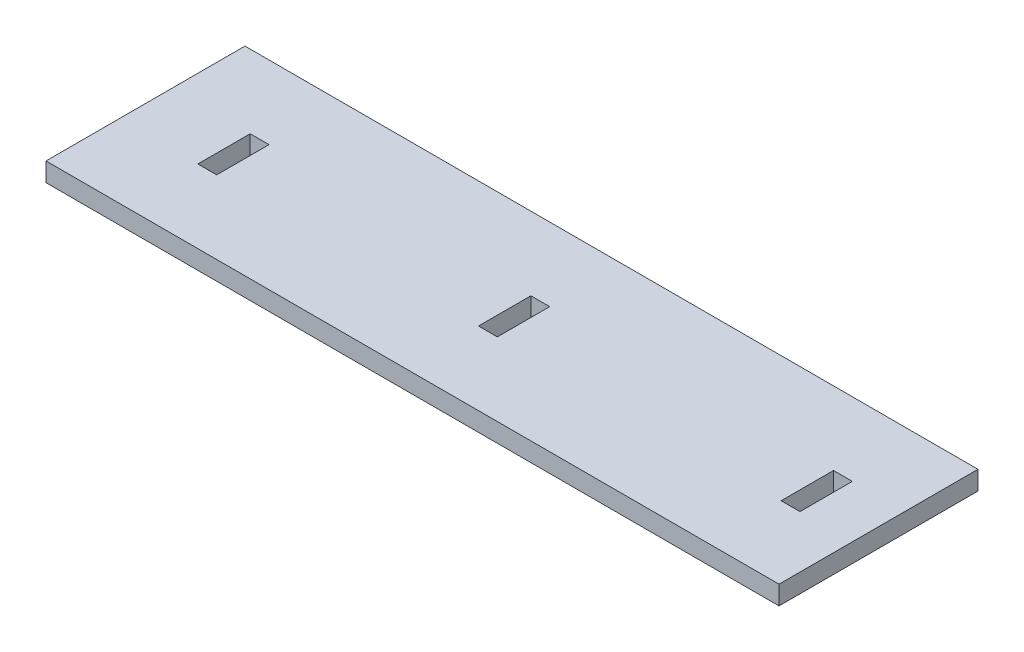
ISO-10303-21;
HEADER;
FILE_DESCRIPTION(('STEP AP214'),'2;1');
FILE_NAME('part.step','',(''),(''),'','','');
FILE_SCHEMA(('AUTOMOTIVE_DESIGN { 1 0 10303 214 1 1 1 1 }'));
ENDSEC;
DATA;
#1=APPLICATION_CONTEXT('core data for automotive mechanical design processes');
#2=APPLICATION_PROTOCOL_DEFINITION('international standard','automotive_design',2000,#1);
#3=PRODUCT_CONTEXT('',#1,'mechanical');
#4=PRODUCT('Part','Part','',(#3));
#5=PRODUCT_RELATED_PRODUCT_CATEGORY('part','',(#4));
#6=PRODUCT_DEFINITION_FORMATION('','',#4);
#7=PRODUCT_DEFINITION_CONTEXT('part definition',#1,'design');
#8=PRODUCT_DEFINITION('design','',#6,#7);
#9=PRODUCT_DEFINITION_SHAPE('','',#8);
#10=(LENGTH_UNIT() NAMED_UNIT(*) SI_UNIT(.MILLI.,.METRE.));
#11=(NAMED_UNIT(*) PLANE_ANGLE_UNIT() SI_UNIT($,.RADIAN.));
#12=(NAMED_UNIT(*) SI_UNIT($,.STERADIAN.) SOLID_ANGLE_UNIT());
#13=UNCERTAINTY_MEASURE_WITH_UNIT(LENGTH_MEASURE(1.E-05),#10,'distance_accuracy_value','');
#14=(GEOMETRIC_REPRESENTATION_CONTEXT(3) GLOBAL_UNCERTAINTY_ASSIGNED_CONTEXT((#13)) GLOBAL_UNIT_ASSIGNED_CONTEXT((#10,
#11,#12)) REPRESENTATION_CONTEXT('',''));
#15=CARTESIAN_POINT('',(0.,0.,0.));
#16=DIRECTION('',(0.,0.,1.));
#17=DIRECTION('',(1.,0.,0.));
#18=AXIS2_PLACEMENT_3D('',#15,#16,#17);
#19=CARTESIAN_POINT('',(0.,4.572,0.));
#20=DIRECTION('',(0.,-1.,0.));
#21=DIRECTION('',(0.,0.,-1.));
#22=AXIS2_PLACEMENT_3D('',#19,#20,#21);
#23=PLANE('',#22);
#24=DIRECTION('',(0.,0.,-1.));
#25=VECTOR('',#24,1.);
#26=CARTESIAN_POINT('',(91.694,4.572,-17.78));
#27=LINE('',#26,#25);
#28=CARTESIAN_POINT('',(91.694,4.572,-17.78));
#29=VERTEX_POINT('',#28);
#30=CARTESIAN_POINT('',(91.694,4.572,-30.48));
#31=VERTEX_POINT('',#30);
#32=EDGE_CURVE('E207',#29,#31,#27,.T.);
#33=ORIENTED_EDGE('',*,*,#32,.F.);
#34=DIRECTION('',(1.,0.,0.));
#35=VECTOR('',#34,1.);
#36=CARTESIAN_POINT('',(91.694,4.572,-17.78));
#37=LINE('',#36,#35);
#38=CARTESIAN_POINT('',(87.122,4.572,-17.78));
#39=VERTEX_POINT('',#38);
#40=EDGE_CURVE('E218',#39,#29,#37,.T.);
#41=ORIENTED_EDGE('',*,*,#40,.F.);
#42=DIRECTION('',(0.,0.,1.));
#43=VECTOR('',#42,1.);
#44=CARTESIAN_POINT('',(87.122,4.572,-17.78));
#45=LINE('',#44,#43);
#46=CARTESIAN_POINT('',(87.122,4.572,-30.48));
#47=VERTEX_POINT('',#46);
#48=EDGE_CURVE('E214',#47,#39,#45,.T.);
#49=ORIENTED_EDGE('',*,*,#48,.F.);
#50=DIRECTION('',(-1.,0.,0.));
#51=VECTOR('',#50,1.);
#52=CARTESIAN_POINT('',(91.694,4.572,-30.48));
#53=LINE('',#52,#51);
#54=EDGE_CURVE('E210',#31,#47,#53,.T.);
#55=ORIENTED_EDGE('',*,*,#54,.F.);
#56=EDGE_LOOP('',(#33,#41,#49,#55));
#57=FACE_BOUND('',#56,.T.);
#58=DIRECTION('',(0.,0.,1.));
#59=VECTOR('',#58,1.);
#60=CARTESIAN_POINT('',(0.,4.572,0.));
#61=LINE('',#60,#59);
#62=CARTESIAN_POINT('',(0.,4.572,-48.26));
#63=VERTEX_POINT('',#62);
#64=CARTESIAN_POINT('',(0.,4.572,0.));
#65=VERTEX_POINT('',#64);
#66=EDGE_CURVE('E293',#63,#65,#61,.T.);
#67=ORIENTED_EDGE('',*,*,#66,.T.);
#68=DIRECTION('',(1.,0.,0.));
#69=VECTOR('',#68,1.);
#70=CARTESIAN_POINT('',(0.,4.572,0.));
#71=LINE('',#70,#69);
#72=CARTESIAN_POINT('',(177.8,4.572,0.));
#73=VERTEX_POINT('',#72);
#74=EDGE_CURVE('E297',#65,#73,#71,.T.);
#75=ORIENTED_EDGE('',*,*,#74,.T.);
#76=DIRECTION('',(0.,0.,-1.));
#77=VECTOR('',#76,1.);
#78=CARTESIAN_POINT('',(177.8,4.572,0.));
#79=LINE('',#78,#77);
#80=CARTESIAN_POINT('',(177.8,4.572,-48.26));
#81=VERTEX_POINT('',#80);
#82=EDGE_CURVE('E301',#73,#81,#79,.T.);
#83=ORIENTED_EDGE('',*,*,#82,.T.);
#84=DIRECTION('',(-1.,0.,0.));
#85=VECTOR('',#84,1.);
#86=CARTESIAN_POINT('',(0.,4.572,-48.26));
#87=LINE('',#86,#85);
#88=EDGE_CURVE('E304',#81,#63,#87,.T.);
#89=ORIENTED_EDGE('',*,*,#88,.T.);
#90=EDGE_LOOP('',(#67,#75,#83,#89));
#91=FACE_BOUND('',#90,.T.);
#92=DIRECTION('',(0.,0.,-1.));
#93=VECTOR('',#92,1.);
#94=CARTESIAN_POINT('',(165.1,4.572,-17.78));
#95=LINE('',#94,#93);
#96=CARTESIAN_POINT('',(165.1,4.572,-17.78));
#97=VERTEX_POINT('',#96);
#98=CARTESIAN_POINT('',(165.1,4.572,-30.48));
#99=VERTEX_POINT('',#98);
#100=EDGE_CURVE('E250',#97,#99,#95,.T.);
#101=ORIENTED_EDGE('',*,*,#100,.F.);
#102=DIRECTION('',(1.,0.,0.));
#103=VECTOR('',#102,1.);
#104=CARTESIAN_POINT('',(165.1,4.572,-17.78));
#105=LINE('',#104,#103);
#106=CARTESIAN_POINT('',(160.528,4.572,-17.78));
#107=VERTEX_POINT('',#106);
#108=EDGE_CURVE('E261',#107,#97,#105,.T.);
#109=ORIENTED_EDGE('',*,*,#108,.F.);
#110=DIRECTION('',(0.,0.,1.));
#111=VECTOR('',#110,1.);
#112=CARTESIAN_POINT('',(160.528,4.572,-17.78));
#113=LINE('',#112,#111);
#114=CARTESIAN_POINT('',(160.528,4.572,-30.48));
#115=VERTEX_POINT('',#114);
#116=EDGE_CURVE('E257',#115,#107,#113,.T.);
#117=ORIENTED_EDGE('',*,*,#116,.F.);
#118=DIRECTION('',(-1.,0.,0.));
#119=VECTOR('',#118,1.);
#120=CARTESIAN_POINT('',(165.1,4.572,-30.48));
#121=LINE('',#120,#119);
#122=EDGE_CURVE('E253',#99,#115,#121,.T.);
#123=ORIENTED_EDGE('',*,*,#122,.F.);
#124=EDGE_LOOP('',(#101,#109,#117,#123));
#125=FACE_BOUND('',#124,.T.);
#126=DIRECTION('',(0.,0.,-1.));
#127=VECTOR('',#126,1.);
#128=CARTESIAN_POINT('',(23.622,4.572,-17.78));
#129=LINE('',#128,#127);
#130=CARTESIAN_POINT('',(23.622,4.572,-17.78));
#131=VERTEX_POINT('',#130);
#132=CARTESIAN_POINT('',(23.622,4.572,-30.48));
#133=VERTEX_POINT('',#132);
#134=EDGE_CURVE('E159',#131,#133,#129,.T.);
#135=ORIENTED_EDGE('',*,*,#134,.F.);
#136=DIRECTION('',(1.,0.,0.));
#137=VECTOR('',#136,1.);
#138=CARTESIAN_POINT('',(23.622,4.572,-17.78));
#139=LINE('',#138,#137);
#140=CARTESIAN_POINT('',(19.05,4.572,-17.78));
#141=VERTEX_POINT('',#140);
#142=EDGE_CURVE('E185',#141,#131,#139,.T.);
#143=ORIENTED_EDGE('',*,*,#142,.F.);
#144=DIRECTION('',(0.,0.,1.));
#145=VECTOR('',#144,1.);
#146=CARTESIAN_POINT('',(19.05,4.572,-17.78));
#147=LINE('',#146,#145);
#148=CARTESIAN_POINT('',(19.05,4.572,-30.48));
#149=VERTEX_POINT('',#148);
#150=EDGE_CURVE('E181',#149,#141,#147,.T.);
#151=ORIENTED_EDGE('',*,*,#150,.F.);
#152=DIRECTION('',(-1.,0.,0.));
#153=VECTOR('',#152,1.);
#154=CARTESIAN_POINT('',(23.622,4.572,-30.48));
#155=LINE('',#154,#153);
#156=EDGE_CURVE('E168',#133,#149,#155,.T.);
#157=ORIENTED_EDGE('',*,*,#156,.F.);
#158=EDGE_LOOP('',(#135,#143,#151,#157));
#159=FACE_BOUND('',#158,.T.);
#160=ADVANCED_FACE('F45',(#57,#91,#125,#159),#23,.F.);
#161=CARTESIAN_POINT('',(0.,0.,0.));
#162=DIRECTION('',(0.,-1.,0.));
#163=DIRECTION('',(0.,0.,-1.));
#164=AXIS2_PLACEMENT_3D('',#161,#162,#163);
#165=PLANE('',#164);
#166=DIRECTION('',(0.,0.,1.));
#167=VECTOR('',#166,1.);
#168=CARTESIAN_POINT('',(0.,0.,0.));
#169=LINE('',#168,#167);
#170=CARTESIAN_POINT('',(0.,0.,-48.26));
#171=VERTEX_POINT('',#170);
#172=CARTESIAN_POINT('',(0.,0.,0.));
#173=VERTEX_POINT('',#172);
#174=EDGE_CURVE('E292',#171,#173,#169,.T.);
#175=ORIENTED_EDGE('',*,*,#174,.F.);
#176=DIRECTION('',(-1.,0.,0.));
#177=VECTOR('',#176,1.);
#178=CARTESIAN_POINT('',(0.,0.,-48.26));
#179=LINE('',#178,#177);
#180=CARTESIAN_POINT('',(177.8,0.,-48.26));
#181=VERTEX_POINT('',#180);
#182=EDGE_CURVE('E298',#181,#171,#179,.T.);
#183=ORIENTED_EDGE('',*,*,#182,.F.);
#184=DIRECTION('',(0.,0.,-1.));
#185=VECTOR('',#184,1.);
#186=CARTESIAN_POINT('',(177.8,0.,0.));
#187=LINE('',#186,#185);
#188=CARTESIAN_POINT('',(177.8,0.,0.));
#189=VERTEX_POINT('',#188);
#190=EDGE_CURVE('E314',#189,#181,#187,.T.);
#191=ORIENTED_EDGE('',*,*,#190,.F.);
#192=DIRECTION('',(1.,0.,0.));
#193=VECTOR('',#192,1.);
#194=CARTESIAN_POINT('',(0.,0.,0.));
#195=LINE('',#194,#193);
#196=EDGE_CURVE('E311',#173,#189,#195,.T.);
#197=ORIENTED_EDGE('',*,*,#196,.F.);
#198=EDGE_LOOP('',(#175,#183,#191,#197));
#199=FACE_BOUND('',#198,.T.);
#200=DIRECTION('',(1.,0.,0.));
#201=VECTOR('',#200,1.);
#202=CARTESIAN_POINT('',(165.1,0.,-17.78));
#203=LINE('',#202,#201);
#204=CARTESIAN_POINT('',(160.528,0.,-17.78));
#205=VERTEX_POINT('',#204);
#206=CARTESIAN_POINT('',(165.1,0.,-17.78));
#207=VERTEX_POINT('',#206);
#208=EDGE_CURVE('E254',#205,#207,#203,.T.);
#209=ORIENTED_EDGE('',*,*,#208,.T.);
#210=DIRECTION('',(0.,0.,-1.));
#211=VECTOR('',#210,1.);
#212=CARTESIAN_POINT('',(165.1,0.,-17.78));
#213=LINE('',#212,#211);
#214=CARTESIAN_POINT('',(165.1,0.,-30.48));
#215=VERTEX_POINT('',#214);
#216=EDGE_CURVE('E249',#207,#215,#213,.T.);
#217=ORIENTED_EDGE('',*,*,#216,.T.);
#218=DIRECTION('',(-1.,0.,0.));
#219=VECTOR('',#218,1.);
#220=CARTESIAN_POINT('',(165.1,0.,-30.48));
#221=LINE('',#220,#219);
#222=CARTESIAN_POINT('',(160.528,0.,-30.48));
#223=VERTEX_POINT('',#222);
#224=EDGE_CURVE('E268',#215,#223,#221,.T.);
#225=ORIENTED_EDGE('',*,*,#224,.T.);
#226=DIRECTION('',(0.,0.,1.));
#227=VECTOR('',#226,1.);
#228=CARTESIAN_POINT('',(160.528,0.,-17.78));
#229=LINE('',#228,#227);
#230=EDGE_CURVE('E272',#223,#205,#229,.T.);
#231=ORIENTED_EDGE('',*,*,#230,.T.);
#232=EDGE_LOOP('',(#209,#217,#225,#231));
#233=FACE_BOUND('',#232,.T.);
#234=DIRECTION('',(1.,0.,0.));
#235=VECTOR('',#234,1.);
#236=CARTESIAN_POINT('',(91.694,0.,-17.78));
#237=LINE('',#236,#235);
#238=CARTESIAN_POINT('',(87.122,0.,-17.78));
#239=VERTEX_POINT('',#238);
#240=CARTESIAN_POINT('',(91.694,0.,-17.78));
#241=VERTEX_POINT('',#240);
#242=EDGE_CURVE('E211',#239,#241,#237,.T.);
#243=ORIENTED_EDGE('',*,*,#242,.T.);
#244=DIRECTION('',(0.,0.,-1.));
#245=VECTOR('',#244,1.);
#246=CARTESIAN_POINT('',(91.694,0.,-17.78));
#247=LINE('',#246,#245);
#248=CARTESIAN_POINT('',(91.694,0.,-30.48));
#249=VERTEX_POINT('',#248);
#250=EDGE_CURVE('E177',#241,#249,#247,.T.);
#251=ORIENTED_EDGE('',*,*,#250,.T.);
#252=DIRECTION('',(-1.,0.,0.));
#253=VECTOR('',#252,1.);
#254=CARTESIAN_POINT('',(91.694,0.,-30.48));
#255=LINE('',#254,#253);
#256=CARTESIAN_POINT('',(87.122,0.,-30.48));
#257=VERTEX_POINT('',#256);
#258=EDGE_CURVE('E225',#249,#257,#255,.T.);
#259=ORIENTED_EDGE('',*,*,#258,.T.);
#260=DIRECTION('',(0.,0.,1.));
#261=VECTOR('',#260,1.);
#262=CARTESIAN_POINT('',(87.122,0.,-17.78));
#263=LINE('',#262,#261);
#264=EDGE_CURVE('E229',#257,#239,#263,.T.);
#265=ORIENTED_EDGE('',*,*,#264,.T.);
#266=EDGE_LOOP('',(#243,#251,#259,#265));
#267=FACE_BOUND('',#266,.T.);
#268=DIRECTION('',(1.,0.,0.));
#269=VECTOR('',#268,1.);
#270=CARTESIAN_POINT('',(23.622,0.,-17.78));
#271=LINE('',#270,#269);
#272=CARTESIAN_POINT('',(19.05,0.,-17.78));
#273=VERTEX_POINT('',#272);
#274=CARTESIAN_POINT('',(23.622,0.,-17.78));
#275=VERTEX_POINT('',#274);
#276=EDGE_CURVE('E169',#273,#275,#271,.T.);
#277=ORIENTED_EDGE('',*,*,#276,.T.);
#278=DIRECTION('',(0.,0.,-1.));
#279=VECTOR('',#278,1.);
#280=CARTESIAN_POINT('',(23.622,0.,-17.78));
#281=LINE('',#280,#279);
#282=CARTESIAN_POINT('',(23.622,0.,-30.48));
#283=VERTEX_POINT('',#282);
#284=EDGE_CURVE('E69',#275,#283,#281,.T.);
#285=ORIENTED_EDGE('',*,*,#284,.T.);
#286=DIRECTION('',(-1.,0.,0.));
#287=VECTOR('',#286,1.);
#288=CARTESIAN_POINT('',(23.622,0.,-30.48));
#289=LINE('',#288,#287);
#290=CARTESIAN_POINT('',(19.05,0.,-30.48));
#291=VERTEX_POINT('',#290);
#292=EDGE_CURVE('E175',#283,#291,#289,.T.);
#293=ORIENTED_EDGE('',*,*,#292,.T.);
#294=DIRECTION('',(0.,0.,1.));
#295=VECTOR('',#294,1.);
#296=CARTESIAN_POINT('',(19.05,0.,-17.78));
#297=LINE('',#296,#295);
#298=EDGE_CURVE('E194',#291,#273,#297,.T.);
#299=ORIENTED_EDGE('',*,*,#298,.T.);
#300=EDGE_LOOP('',(#277,#285,#293,#299));
#301=FACE_BOUND('',#300,.T.);
#302=ADVANCED_FACE('F337',(#199,#233,#267,#301),#165,.T.);
#303=CARTESIAN_POINT('',(0.,4.572,0.));
#304=DIRECTION('',(1.,0.,0.));
#305=DIRECTION('',(0.,0.,-1.));
#306=AXIS2_PLACEMENT_3D('',#303,#304,#305);
#307=PLANE('',#306);
#308=ORIENTED_EDGE('',*,*,#174,.T.);
#309=DIRECTION('',(0.,-1.,0.));
#310=VECTOR('',#309,1.);
#311=CARTESIAN_POINT('',(0.,4.572,0.));
#312=LINE('',#311,#310);
#313=EDGE_CURVE('E11',#65,#173,#312,.T.);
#314=ORIENTED_EDGE('',*,*,#313,.F.);
#315=ORIENTED_EDGE('',*,*,#66,.F.);
#316=DIRECTION('',(0.,-1.,0.));
#317=VECTOR('',#316,1.);
#318=CARTESIAN_POINT('',(0.,4.572,-48.26));
#319=LINE('',#318,#317);
#320=EDGE_CURVE('E307',#63,#171,#319,.T.);
#321=ORIENTED_EDGE('',*,*,#320,.T.);
#322=EDGE_LOOP('',(#308,#314,#315,#321));
#323=FACE_BOUND('',#322,.T.);
#324=ADVANCED_FACE('F47',(#323),#307,.F.);
#325=CARTESIAN_POINT('',(0.,4.572,0.));
#326=DIRECTION('',(0.,0.,-1.));
#327=DIRECTION('',(-1.,0.,0.));
#328=AXIS2_PLACEMENT_3D('',#325,#326,#327);
#329=PLANE('',#328);
#330=ORIENTED_EDGE('',*,*,#196,.T.);
#331=DIRECTION('',(0.,-1.,0.));
#332=VECTOR('',#331,1.);
#333=CARTESIAN_POINT('',(177.8,4.572,0.));
#334=LINE('',#333,#332);
#335=EDGE_CURVE('E54',#73,#189,#334,.T.);
#336=ORIENTED_EDGE('',*,*,#335,.F.);
#337=ORIENTED_EDGE('',*,*,#74,.F.);
#338=ORIENTED_EDGE('',*,*,#313,.T.);
#339=EDGE_LOOP('',(#330,#336,#337,#338));
#340=FACE_BOUND('',#339,.T.);
#341=ADVANCED_FACE('F348',(#340),#329,.F.);
#342=CARTESIAN_POINT('',(177.8,4.572,0.));
#343=DIRECTION('',(-1.,0.,0.));
#344=DIRECTION('',(0.,0.,1.));
#345=AXIS2_PLACEMENT_3D('',#342,#343,#344);
#346=PLANE('',#345);
#347=ORIENTED_EDGE('',*,*,#190,.T.);
#348=DIRECTION('',(0.,-1.,0.));
#349=VECTOR('',#348,1.);
#350=CARTESIAN_POINT('',(177.8,4.572,-48.26));
#351=LINE('',#350,#349);
#352=EDGE_CURVE('E322',#81,#181,#351,.T.);
#353=ORIENTED_EDGE('',*,*,#352,.F.);
#354=ORIENTED_EDGE('',*,*,#82,.F.);
#355=ORIENTED_EDGE('',*,*,#335,.T.);
#356=EDGE_LOOP('',(#347,#353,#354,#355));
#357=FACE_BOUND('',#356,.T.);
#358=ADVANCED_FACE('F331',(#357),#346,.F.);
#359=CARTESIAN_POINT('',(0.,4.572,-48.26));
#360=DIRECTION('',(0.,0.,1.));
#361=DIRECTION('',(1.,0.,0.));
#362=AXIS2_PLACEMENT_3D('',#359,#360,#361);
#363=PLANE('',#362);
#364=ORIENTED_EDGE('',*,*,#182,.T.);
#365=ORIENTED_EDGE('',*,*,#320,.F.);
#366=ORIENTED_EDGE('',*,*,#88,.F.);
#367=ORIENTED_EDGE('',*,*,#352,.T.);
#368=EDGE_LOOP('',(#364,#365,#366,#367));
#369=FACE_BOUND('',#368,.T.);
#370=ADVANCED_FACE('F341',(#369),#363,.F.);
#371=CARTESIAN_POINT('',(165.1,4.572,-17.78));
#372=DIRECTION('',(-1.,0.,0.));
#373=DIRECTION('',(0.,0.,1.));
#374=AXIS2_PLACEMENT_3D('',#371,#372,#373);
#375=PLANE('',#374);
#376=ORIENTED_EDGE('',*,*,#216,.F.);
#377=DIRECTION('',(0.,-1.,0.));
#378=VECTOR('',#377,1.);
#379=CARTESIAN_POINT('',(165.1,4.572,-17.78));
#380=LINE('',#379,#378);
#381=EDGE_CURVE('E264',#97,#207,#380,.T.);
#382=ORIENTED_EDGE('',*,*,#381,.F.);
#383=ORIENTED_EDGE('',*,*,#100,.T.);
#384=DIRECTION('',(0.,-1.,0.));
#385=VECTOR('',#384,1.);
#386=CARTESIAN_POINT('',(165.1,4.572,-30.48));
#387=LINE('',#386,#385);
#388=EDGE_CURVE('E288',#99,#215,#387,.T.);
#389=ORIENTED_EDGE('',*,*,#388,.T.);
#390=EDGE_LOOP('',(#376,#382,#383,#389));
#391=FACE_BOUND('',#390,.T.);
#392=ADVANCED_FACE('F364',(#391),#375,.T.);
#393=CARTESIAN_POINT('',(165.1,4.572,-30.48));
#394=DIRECTION('',(0.,0.,1.));
#395=DIRECTION('',(1.,0.,0.));
#396=AXIS2_PLACEMENT_3D('',#393,#394,#395);
#397=PLANE('',#396);
#398=ORIENTED_EDGE('',*,*,#224,.F.);
#399=ORIENTED_EDGE('',*,*,#388,.F.);
#400=ORIENTED_EDGE('',*,*,#122,.T.);
#401=DIRECTION('',(0.,-1.,0.));
#402=VECTOR('',#401,1.);
#403=CARTESIAN_POINT('',(160.528,4.572,-30.48));
#404=LINE('',#403,#402);
#405=EDGE_CURVE('E285',#115,#223,#404,.T.);
#406=ORIENTED_EDGE('',*,*,#405,.T.);
#407=EDGE_LOOP('',(#398,#399,#400,#406));
#408=FACE_BOUND('',#407,.T.);
#409=ADVANCED_FACE('F371',(#408),#397,.T.);
#410=CARTESIAN_POINT('',(160.528,4.572,-17.78));
#411=DIRECTION('',(1.,0.,0.));
#412=DIRECTION('',(0.,0.,-1.));
#413=AXIS2_PLACEMENT_3D('',#410,#411,#412);
#414=PLANE('',#413);
#415=ORIENTED_EDGE('',*,*,#230,.F.);
#416=ORIENTED_EDGE('',*,*,#405,.F.);
#417=ORIENTED_EDGE('',*,*,#116,.T.);
#418=DIRECTION('',(0.,-1.,0.));
#419=VECTOR('',#418,1.);
#420=CARTESIAN_POINT('',(160.528,4.572,-17.78));
#421=LINE('',#420,#419);
#422=EDGE_CURVE('E282',#107,#205,#421,.T.);
#423=ORIENTED_EDGE('',*,*,#422,.T.);
#424=EDGE_LOOP('',(#415,#416,#417,#423));
#425=FACE_BOUND('',#424,.T.);
#426=ADVANCED_FACE('F376',(#425),#414,.T.);
#427=CARTESIAN_POINT('',(165.1,4.572,-17.78));
#428=DIRECTION('',(0.,0.,-1.));
#429=DIRECTION('',(-1.,0.,0.));
#430=AXIS2_PLACEMENT_3D('',#427,#428,#429);
#431=PLANE('',#430);
#432=ORIENTED_EDGE('',*,*,#208,.F.);
#433=ORIENTED_EDGE('',*,*,#422,.F.);
#434=ORIENTED_EDGE('',*,*,#108,.T.);
#435=ORIENTED_EDGE('',*,*,#381,.T.);
#436=EDGE_LOOP('',(#432,#433,#434,#435));
#437=FACE_BOUND('',#436,.T.);
#438=ADVANCED_FACE('F383',(#437),#431,.T.);
#439=CARTESIAN_POINT('',(91.694,4.572,-17.78));
#440=DIRECTION('',(-1.,0.,0.));
#441=DIRECTION('',(0.,0.,1.));
#442=AXIS2_PLACEMENT_3D('',#439,#440,#441);
#443=PLANE('',#442);
#444=ORIENTED_EDGE('',*,*,#250,.F.);
#445=DIRECTION('',(0.,-1.,0.));
#446=VECTOR('',#445,1.);
#447=CARTESIAN_POINT('',(91.694,4.572,-17.78));
#448=LINE('',#447,#446);
#449=EDGE_CURVE('E221',#29,#241,#448,.T.);
#450=ORIENTED_EDGE('',*,*,#449,.F.);
#451=ORIENTED_EDGE('',*,*,#32,.T.);
#452=DIRECTION('',(0.,-1.,0.));
#453=VECTOR('',#452,1.);
#454=CARTESIAN_POINT('',(91.694,4.572,-30.48));
#455=LINE('',#454,#453);
#456=EDGE_CURVE('E245',#31,#249,#455,.T.);
#457=ORIENTED_EDGE('',*,*,#456,.T.);
#458=EDGE_LOOP('',(#444,#450,#451,#457));
#459=FACE_BOUND('',#458,.T.);
#460=ADVANCED_FACE('F396',(#459),#443,.T.);
#461=CARTESIAN_POINT('',(91.694,4.572,-30.48));
#462=DIRECTION('',(0.,0.,1.));
#463=DIRECTION('',(1.,0.,0.));
#464=AXIS2_PLACEMENT_3D('',#461,#462,#463);
#465=PLANE('',#464);
#466=ORIENTED_EDGE('',*,*,#258,.F.);
#467=ORIENTED_EDGE('',*,*,#456,.F.);
#468=ORIENTED_EDGE('',*,*,#54,.T.);
#469=DIRECTION('',(0.,-1.,0.));
#470=VECTOR('',#469,1.);
#471=CARTESIAN_POINT('',(87.122,4.572,-30.48));
#472=LINE('',#471,#470);
#473=EDGE_CURVE('E242',#47,#257,#472,.T.);
#474=ORIENTED_EDGE('',*,*,#473,.T.);
#475=EDGE_LOOP('',(#466,#467,#468,#474));
#476=FACE_BOUND('',#475,.T.);
#477=ADVANCED_FACE('F401',(#476),#465,.T.);
#478=CARTESIAN_POINT('',(87.122,4.572,-17.78));
#479=DIRECTION('',(1.,0.,0.));
#480=DIRECTION('',(0.,0.,-1.));
#481=AXIS2_PLACEMENT_3D('',#478,#479,#480);
#482=PLANE('',#481);
#483=ORIENTED_EDGE('',*,*,#264,.F.);
#484=ORIENTED_EDGE('',*,*,#473,.F.);
#485=ORIENTED_EDGE('',*,*,#48,.T.);
#486=DIRECTION('',(0.,-1.,0.));
#487=VECTOR('',#486,1.);
#488=CARTESIAN_POINT('',(87.122,4.572,-17.78));
#489=LINE('',#488,#487);
#490=EDGE_CURVE('E239',#39,#239,#489,.T.);
#491=ORIENTED_EDGE('',*,*,#490,.T.);
#492=EDGE_LOOP('',(#483,#484,#485,#491));
#493=FACE_BOUND('',#492,.T.);
#494=ADVANCED_FACE('F405',(#493),#482,.T.);
#495=CARTESIAN_POINT('',(91.694,4.572,-17.78));
#496=DIRECTION('',(0.,0.,-1.));
#497=DIRECTION('',(-1.,0.,0.));
#498=AXIS2_PLACEMENT_3D('',#495,#496,#497);
#499=PLANE('',#498);
#500=ORIENTED_EDGE('',*,*,#242,.F.);
#501=ORIENTED_EDGE('',*,*,#490,.F.);
#502=ORIENTED_EDGE('',*,*,#40,.T.);
#503=ORIENTED_EDGE('',*,*,#449,.T.);
#504=EDGE_LOOP('',(#500,#501,#502,#503));
#505=FACE_BOUND('',#504,.T.);
#506=ADVANCED_FACE('F409',(#505),#499,.T.);
#507=CARTESIAN_POINT('',(23.622,4.572,-17.78));
#508=DIRECTION('',(-1.,0.,0.));
#509=DIRECTION('',(0.,0.,1.));
#510=AXIS2_PLACEMENT_3D('',#507,#508,#509);
#511=PLANE('',#510);
#512=ORIENTED_EDGE('',*,*,#284,.F.);
#513=DIRECTION('',(0.,-1.,0.));
#514=VECTOR('',#513,1.);
#515=CARTESIAN_POINT('',(23.622,4.572,-17.78));
#516=LINE('',#515,#514);
#517=EDGE_CURVE('E163',#131,#275,#516,.T.);
#518=ORIENTED_EDGE('',*,*,#517,.F.);
#519=ORIENTED_EDGE('',*,*,#134,.T.);
#520=DIRECTION('',(0.,-1.,0.));
#521=VECTOR('',#520,1.);
#522=CARTESIAN_POINT('',(23.622,4.572,-30.48));
#523=LINE('',#522,#521);
#524=EDGE_CURVE('E162',#133,#283,#523,.T.);
#525=ORIENTED_EDGE('',*,*,#524,.T.);
#526=EDGE_LOOP('',(#512,#518,#519,#525));
#527=FACE_BOUND('',#526,.T.);
#528=ADVANCED_FACE('F161',(#527),#511,.T.);
#529=CARTESIAN_POINT('',(23.622,4.572,-30.48));
#530=DIRECTION('',(0.,0.,1.));
#531=DIRECTION('',(1.,0.,0.));
#532=AXIS2_PLACEMENT_3D('',#529,#530,#531);
#533=PLANE('',#532);
#534=ORIENTED_EDGE('',*,*,#292,.F.);
#535=ORIENTED_EDGE('',*,*,#524,.F.);
#536=ORIENTED_EDGE('',*,*,#156,.T.);
#537=DIRECTION('',(0.,-1.,0.));
#538=VECTOR('',#537,1.);
#539=CARTESIAN_POINT('',(19.05,4.572,-30.48));
#540=LINE('',#539,#538);
#541=EDGE_CURVE('E178',#149,#291,#540,.T.);
#542=ORIENTED_EDGE('',*,*,#541,.T.);
#543=EDGE_LOOP('',(#534,#535,#536,#542));
#544=FACE_BOUND('',#543,.T.);
#545=ADVANCED_FACE('F172',(#544),#533,.T.);
#546=CARTESIAN_POINT('',(19.05,4.572,-17.78));
#547=DIRECTION('',(1.,0.,0.));
#548=DIRECTION('',(0.,0.,-1.));
#549=AXIS2_PLACEMENT_3D('',#546,#547,#548);
#550=PLANE('',#549);
#551=ORIENTED_EDGE('',*,*,#298,.F.);
#552=ORIENTED_EDGE('',*,*,#541,.F.);
#553=ORIENTED_EDGE('',*,*,#150,.T.);
#554=DIRECTION('',(0.,-1.,0.));
#555=VECTOR('',#554,1.);
#556=CARTESIAN_POINT('',(19.05,4.572,-17.78));
#557=LINE('',#556,#555);
#558=EDGE_CURVE('E61',#141,#273,#557,.T.);
#559=ORIENTED_EDGE('',*,*,#558,.T.);
#560=EDGE_LOOP('',(#551,#552,#553,#559));
#561=FACE_BOUND('',#560,.T.);
#562=ADVANCED_FACE('F418',(#561),#550,.T.);
#563=CARTESIAN_POINT('',(23.622,4.572,-17.78));
#564=DIRECTION('',(0.,0.,-1.));
#565=DIRECTION('',(-1.,0.,0.));
#566=AXIS2_PLACEMENT_3D('',#563,#564,#565);
#567=PLANE('',#566);
#568=ORIENTED_EDGE('',*,*,#276,.F.);
#569=ORIENTED_EDGE('',*,*,#558,.F.);
#570=ORIENTED_EDGE('',*,*,#142,.T.);
#571=ORIENTED_EDGE('',*,*,#517,.T.);
#572=EDGE_LOOP('',(#568,#569,#570,#571));
#573=FACE_BOUND('',#572,.T.);
#574=ADVANCED_FACE('F421',(#573),#567,.T.);
#575=CLOSED_SHELL('',(#160,#302,#324,#341,#358,#370,#392,#409,#426,#438,#460,#477,#494,#506,
#528,#545,#562,#574));
#576=MANIFOLD_SOLID_BREP('B2',#575);
#577=ADVANCED_BREP_SHAPE_REPRESENTATION('',(#18,#576),#14);
#578=SHAPE_DEFINITION_REPRESENTATION(#9,#577);
ENDSEC;
END-ISO-10303-21;
